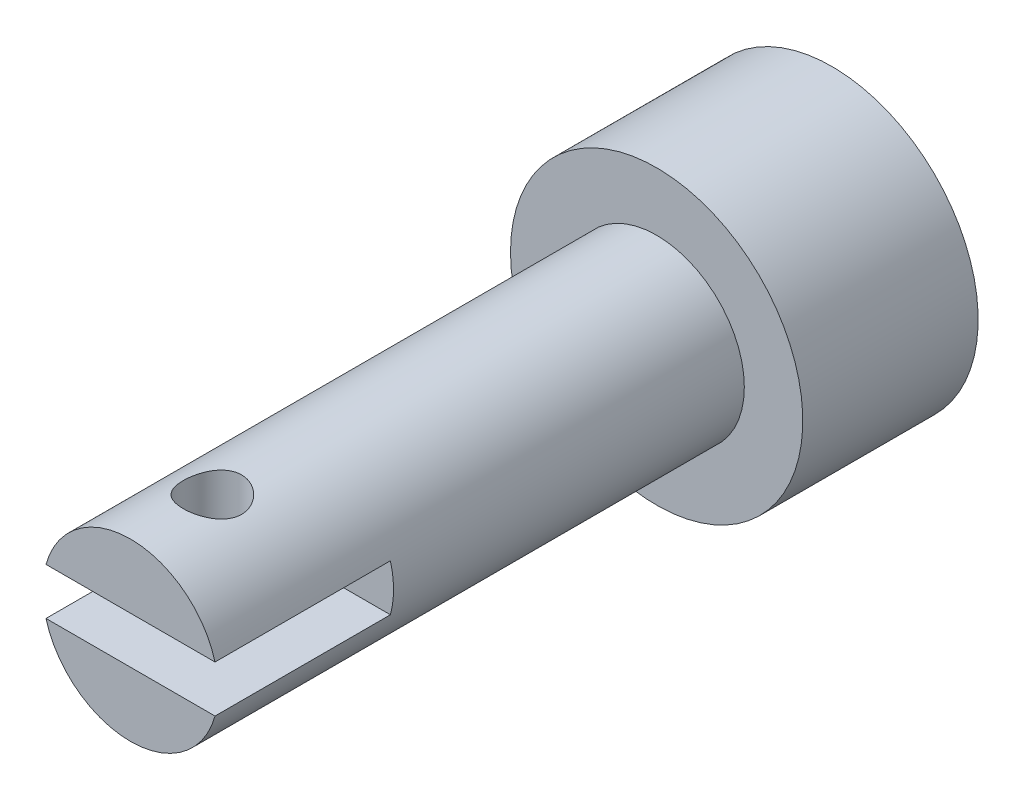
ISO-10303-21;
HEADER;
FILE_DESCRIPTION(('STEP AP214'),'2;1');
FILE_NAME('part.step','',(''),(''),'','','');
FILE_SCHEMA(('AUTOMOTIVE_DESIGN { 1 0 10303 214 1 1 1 1 }'));
ENDSEC;
DATA;
#1=APPLICATION_CONTEXT('core data for automotive mechanical design processes');
#2=APPLICATION_PROTOCOL_DEFINITION('international standard','automotive_design',2000,#1);
#3=PRODUCT_CONTEXT('',#1,'mechanical');
#4=PRODUCT('Part','Part','',(#3));
#5=PRODUCT_RELATED_PRODUCT_CATEGORY('part','',(#4));
#6=PRODUCT_DEFINITION_FORMATION('','',#4);
#7=PRODUCT_DEFINITION_CONTEXT('part definition',#1,'design');
#8=PRODUCT_DEFINITION('design','',#6,#7);
#9=PRODUCT_DEFINITION_SHAPE('','',#8);
#10=(LENGTH_UNIT() NAMED_UNIT(*) SI_UNIT(.MILLI.,.METRE.));
#11=(NAMED_UNIT(*) PLANE_ANGLE_UNIT() SI_UNIT($,.RADIAN.));
#12=(NAMED_UNIT(*) SI_UNIT($,.STERADIAN.) SOLID_ANGLE_UNIT());
#13=UNCERTAINTY_MEASURE_WITH_UNIT(LENGTH_MEASURE(1.E-05),#10,'distance_accuracy_value','');
#14=(GEOMETRIC_REPRESENTATION_CONTEXT(3) GLOBAL_UNCERTAINTY_ASSIGNED_CONTEXT((#13)) GLOBAL_UNIT_ASSIGNED_CONTEXT((#10,
#11,#12)) REPRESENTATION_CONTEXT('',''));
#15=CARTESIAN_POINT('',(0.,0.,0.));
#16=DIRECTION('',(0.,0.,1.));
#17=DIRECTION('',(1.,0.,0.));
#18=AXIS2_PLACEMENT_3D('',#15,#16,#17);
#19=CARTESIAN_POINT('',(0.,0.,30.));
#20=DIRECTION('',(0.,0.,-1.));
#21=DIRECTION('',(-1.,0.,0.));
#22=AXIS2_PLACEMENT_3D('',#19,#20,#21);
#23=CYLINDRICAL_SURFACE('',#22,7.5);
#24=CARTESIAN_POINT('',(0.,0.,15.));
#25=DIRECTION('',(0.,0.,1.));
#26=DIRECTION('',(1.,0.,0.));
#27=AXIS2_PLACEMENT_3D('',#24,#25,#26);
#28=CIRCLE('',#27,7.5);
#29=CARTESIAN_POINT('',(-7.22841614740048,2.,15.));
#30=VERTEX_POINT('',#29);
#31=CARTESIAN_POINT('',(-7.22841614740048,-2.,15.));
#32=VERTEX_POINT('',#31);
#33=EDGE_CURVE('E45',#30,#32,#28,.T.);
#34=ORIENTED_EDGE('',*,*,#33,.F.);
#35=DIRECTION('',(0.,0.,-1.));
#36=VECTOR('',#35,1.);
#37=CARTESIAN_POINT('',(-7.22841614740048,2.,30.));
#38=LINE('',#37,#36);
#39=CARTESIAN_POINT('',(-7.22841614740048,2.,30.));
#40=VERTEX_POINT('',#39);
#41=EDGE_CURVE('E60',#30,#40,#38,.F.);
#42=ORIENTED_EDGE('',*,*,#41,.T.);
#43=CARTESIAN_POINT('',(0.,0.,30.));
#44=DIRECTION('',(0.,0.,1.));
#45=DIRECTION('',(1.,0.,0.));
#46=AXIS2_PLACEMENT_3D('',#43,#44,#45);
#47=CIRCLE('',#46,7.5);
#48=CARTESIAN_POINT('',(7.22841614740048,2.,30.));
#49=VERTEX_POINT('',#48);
#50=EDGE_CURVE('E86',#49,#40,#47,.T.);
#51=ORIENTED_EDGE('',*,*,#50,.F.);
#52=DIRECTION('',(0.,0.,-1.));
#53=VECTOR('',#52,1.);
#54=CARTESIAN_POINT('',(7.22841614740048,2.,30.));
#55=LINE('',#54,#53);
#56=CARTESIAN_POINT('',(7.22841614740048,2.,15.));
#57=VERTEX_POINT('',#56);
#58=EDGE_CURVE('E98',#49,#57,#55,.T.);
#59=ORIENTED_EDGE('',*,*,#58,.T.);
#60=CARTESIAN_POINT('',(7.22841614740048,-2.,15.));
#61=VERTEX_POINT('',#60);
#62=EDGE_CURVE('E94',#61,#57,#28,.T.);
#63=ORIENTED_EDGE('',*,*,#62,.F.);
#64=DIRECTION('',(0.,0.,-1.));
#65=VECTOR('',#64,1.);
#66=CARTESIAN_POINT('',(7.22841614740048,-2.,30.));
#67=LINE('',#66,#65);
#68=CARTESIAN_POINT('',(7.22841614740048,-2.,30.));
#69=VERTEX_POINT('',#68);
#70=EDGE_CURVE('E80',#61,#69,#67,.F.);
#71=ORIENTED_EDGE('',*,*,#70,.T.);
#72=CARTESIAN_POINT('',(-7.22841614740048,-2.,30.));
#73=VERTEX_POINT('',#72);
#74=EDGE_CURVE('E92',#73,#69,#47,.T.);
#75=ORIENTED_EDGE('',*,*,#74,.F.);
#76=DIRECTION('',(0.,0.,-1.));
#77=VECTOR('',#76,1.);
#78=CARTESIAN_POINT('',(-7.22841614740048,-2.,30.));
#79=LINE('',#78,#77);
#80=EDGE_CURVE('E52',#73,#32,#79,.T.);
#81=ORIENTED_EDGE('',*,*,#80,.T.);
#82=EDGE_LOOP('',(#34,#42,#51,#59,#63,#71,#75,#81));
#83=FACE_BOUND('',#82,.T.);
#84=CARTESIAN_POINT('',(0.,7.5,25.5));
#85=CARTESIAN_POINT('',(-0.136408407216808,7.5000003825236,25.5000006343291));
#86=CARTESIAN_POINT('',(-0.272812986346374,7.49624423768862,25.488799334682));
#87=CARTESIAN_POINT('',(-0.54160440218243,7.48163025508202,25.444427227957));
#88=CARTESIAN_POINT('',(-0.673990820297044,7.47077168005381,25.4112541401277));
#89=CARTESIAN_POINT('',(-0.930831973754441,7.44313269766107,25.3242018915399));
#90=CARTESIAN_POINT('',(-1.05529956471509,7.42636219327133,25.2703573438518));
#91=CARTESIAN_POINT('',(-1.29343734201331,7.38861114293354,25.1436470679041));
#92=CARTESIAN_POINT('',(-1.40710539239676,7.36762976669445,25.0707775874935));
#93=CARTESIAN_POINT('',(-1.62435418755567,7.32285236107512,24.9054354878531));
#94=CARTESIAN_POINT('',(-1.72750925074577,7.29898891159462,24.8124219143488));
#95=CARTESIAN_POINT('',(-1.91708173175521,7.25150786957803,24.6105821132336));
#96=CARTESIAN_POINT('',(-2.00349546372366,7.22789033226373,24.5017524126787));
#97=CARTESIAN_POINT('',(-2.15956235556965,7.18283331193184,24.2675372120089));
#98=CARTESIAN_POINT('',(-2.22866214555258,7.1614759818922,24.1417656506697));
#99=CARTESIAN_POINT('',(-2.3445471846943,7.12438263546503,23.8795597638536));
#100=CARTESIAN_POINT('',(-2.39133924346691,7.10864490401864,23.7431287070931));
#101=CARTESIAN_POINT('',(-2.45968365377291,7.08528258173443,23.4683169462582));
#102=CARTESIAN_POINT('',(-2.48203362067942,7.07740239424028,23.3301569787773));
#103=CARTESIAN_POINT('',(-2.50335280833619,7.06989141573769,23.0518406146103));
#104=CARTESIAN_POINT('',(-2.5023292540118,7.07025807556825,22.911684848227));
#105=CARTESIAN_POINT('',(-2.47754975925855,7.0789753752045,22.6401584238899));
#106=CARTESIAN_POINT('',(-2.45483478291749,7.08696039668832,22.5086789927025));
#107=CARTESIAN_POINT('',(-2.38901540712355,7.10941644311377,22.2515164509829));
#108=CARTESIAN_POINT('',(-2.34590856647968,7.12388824460269,22.1258340364123));
#109=CARTESIAN_POINT('',(-2.23984764515053,7.15794777828122,21.8814681260213));
#110=CARTESIAN_POINT('',(-2.17658512176816,7.17761414482793,21.7629299363262));
#111=CARTESIAN_POINT('',(-2.03222276575785,7.21981396439316,21.5378227293007));
#112=CARTESIAN_POINT('',(-1.95111778091001,7.24234824476159,21.4312571826665));
#113=CARTESIAN_POINT('',(-1.76837333170559,7.28918322919352,21.2272710045981));
#114=CARTESIAN_POINT('',(-1.66588287519078,7.31351473387107,21.1306182637273));
#115=CARTESIAN_POINT('',(-1.44584892492516,7.36017345967592,20.9556718333415));
#116=CARTESIAN_POINT('',(-1.32830398915204,7.38250048845168,20.8773799045888));
#117=CARTESIAN_POINT('',(-1.07986903261567,7.42292769844484,20.7407592494123));
#118=CARTESIAN_POINT('',(-0.948858191040844,7.44098375020098,20.6826362716482));
#119=CARTESIAN_POINT('',(-0.678172708411271,7.47051417861087,20.5894920651107));
#120=CARTESIAN_POINT('',(-0.538501095387386,7.48199084137198,20.5544628114414));
#121=CARTESIAN_POINT('',(-0.260959573823261,7.49669067678601,20.5098608349441));
#122=CARTESIAN_POINT('',(-0.123273999662116,7.5002500458432,20.4992504770681));
#123=CARTESIAN_POINT('',(0.151937674900593,7.49972256737068,20.5008316839962));
#124=CARTESIAN_POINT('',(0.289463798299125,7.49563701048406,20.5130193999497));
#125=CARTESIAN_POINT('',(0.556299665760638,7.48050061792761,20.5590297693399));
#126=CARTESIAN_POINT('',(0.685732017087108,7.46965496777981,20.5922155151237));
#127=CARTESIAN_POINT('',(0.937139896448934,7.44229617075175,20.6784836111668));
#128=CARTESIAN_POINT('',(1.05911447127152,7.42578230116688,20.7315684986695));
#129=CARTESIAN_POINT('',(1.29572074098318,7.38822328218224,20.857676079602));
#130=CARTESIAN_POINT('',(1.41007489804287,7.36707036889465,20.9311864832079));
#131=CARTESIAN_POINT('',(1.62516207533897,7.32263134790656,21.0954853750337));
#132=CARTESIAN_POINT('',(1.72589091948894,7.29934458984569,21.1862791400794));
#133=CARTESIAN_POINT('',(1.91563126951575,7.25192119951112,21.3874468775165));
#134=CARTESIAN_POINT('',(2.00390242311443,7.2277940271857,21.4985230673172));
#135=CARTESIAN_POINT('',(2.16064380580894,7.18249933236772,21.7344289195272));
#136=CARTESIAN_POINT('',(2.22911386982753,7.16133183455006,21.8592586965852));
#137=CARTESIAN_POINT('',(2.34399232604091,7.12455979478459,22.1191825382247));
#138=CARTESIAN_POINT('',(2.39044533041255,7.10894401982447,22.2542551979219));
#139=CARTESIAN_POINT('',(2.45973666689839,7.08527080766124,22.5309466251103));
#140=CARTESIAN_POINT('',(2.48258563738485,7.07720996559098,22.6725624135109));
#141=CARTESIAN_POINT('',(2.50319070619336,7.06994647185443,22.9504927401023));
#142=CARTESIAN_POINT('',(2.502175643271,7.07031000643538,23.0867058507171));
#143=CARTESIAN_POINT('',(2.47810573362174,7.07878174559668,23.3569126873052));
#144=CARTESIAN_POINT('',(2.45505219864647,7.08688948923404,23.4909065448877));
#145=CARTESIAN_POINT('',(2.38842953282337,7.10961310762229,23.7503391575062));
#146=CARTESIAN_POINT('',(2.34525836503879,7.12410245056194,23.8758920625112));
#147=CARTESIAN_POINT('',(2.23994841439937,7.15790997046171,24.1180685173457));
#148=CARTESIAN_POINT('',(2.17780542138452,7.17722921908483,24.23469007797));
#149=CARTESIAN_POINT('',(2.03315173145858,7.21957073065116,24.4612091748073));
#150=CARTESIAN_POINT('',(1.94987060691145,7.24271779105343,24.570591254746));
#151=CARTESIAN_POINT('',(1.76660720783912,7.28958390708132,24.7742245334605));
#152=CARTESIAN_POINT('',(1.66662021112871,7.31330312280931,24.8684714392202));
#153=CARTESIAN_POINT('',(1.44810389230172,7.3597507631386,25.0428610307229));
#154=CARTESIAN_POINT('',(1.32900378374933,7.38240454503141,25.1223108693775));
#155=CARTESIAN_POINT('',(1.07839339351657,7.4231497793153,25.2599760721266));
#156=CARTESIAN_POINT('',(0.946886295330875,7.44124239769824,25.3181968648051));
#157=CARTESIAN_POINT('',(0.681234118002442,7.47013787671354,25.4093040812217));
#158=CARTESIAN_POINT('',(0.547469394191023,7.48123031056307,25.4432061656584));
#159=CARTESIAN_POINT('',(0.275801040025618,7.49616017660555,25.4885507016928));
#160=CARTESIAN_POINT('',(0.137898563921866,7.49999961329762,25.4999993587413));
#161=CARTESIAN_POINT('',(0.,7.5,25.5));
#162=B_SPLINE_CURVE_WITH_KNOTS('',3,(#84,#85,#86,#87,#88,#89,#90,#91,#92,#93,#94,#95,#96,#97,
#98,#99,#100,#101,#102,#103,#104,#105,#106,#107,#108,#109,#110,#111,#112,#113,#114,#115,#116,
#117,#118,#119,#120,#121,#122,#123,#124,#125,#126,#127,#128,#129,#130,#131,#132,#133,#134,#135,
#136,#137,#138,#139,#140,#141,#142,#143,#144,#145,#146,#147,#148,#149,#150,#151,#152,#153,#154,
#155,#156,#157,#158,#159,#160,#161),.UNSPECIFIED.,.T.,.F.,(4,2,2,2,2,2,2,2,2,2,2,2,2,2,2,2,2,2,
2,2,2,2,2,2,2,2,2,2,2,2,2,2,2,2,2,2,2,2,4),(0.,0.408717765065027,0.817477963168801,
1.22555668217568,1.63371594449775,2.0546171070689,2.47561083218826,2.90870962058676,
3.34167611732083,3.760048143546,4.17829084968714,4.57742066378201,4.97659827138705,
5.38220427887827,5.78792756395519,6.21483264528418,6.64177864916546,7.07296014125894,
7.50399172193021,7.91633957937925,8.32861782910442,8.72895394945534,9.1293411321026,
9.54025999609341,9.95130452054728,10.3810255720188,10.8107502058749,11.2396003456693,
11.668257117646,12.0748916516065,12.4815019837844,12.8803896770104,13.2793659543994,
13.6957516672951,14.1122552780945,14.5449915208775,14.9776170288114,15.3909139593453,
15.8040966509535),.UNSPECIFIED.);
#163=CARTESIAN_POINT('',(0.,7.5,25.5));
#164=VERTEX_POINT('',#163);
#165=EDGE_CURVE('E112',#164,#164,#162,.T.);
#166=ORIENTED_EDGE('',*,*,#165,.T.);
#167=EDGE_LOOP('',(#166));
#168=FACE_BOUND('',#167,.T.);
#169=CARTESIAN_POINT('',(0.,-7.5,25.5));
#170=CARTESIAN_POINT('',(0.136408407216808,-7.5000003825236,25.5000006343291));
#171=CARTESIAN_POINT('',(0.272812986346374,-7.49624423768862,25.488799334682));
#172=CARTESIAN_POINT('',(0.54160440218243,-7.48163025508202,25.444427227957));
#173=CARTESIAN_POINT('',(0.673990820297044,-7.47077168005381,25.4112541401277));
#174=CARTESIAN_POINT('',(0.930831973754441,-7.44313269766107,25.3242018915399));
#175=CARTESIAN_POINT('',(1.05529956471509,-7.42636219327133,25.2703573438518));
#176=CARTESIAN_POINT('',(1.29343734201331,-7.38861114293354,25.1436470679041));
#177=CARTESIAN_POINT('',(1.40710539239676,-7.36762976669445,25.0707775874935));
#178=CARTESIAN_POINT('',(1.62435418755567,-7.32285236107512,24.9054354878531));
#179=CARTESIAN_POINT('',(1.72750925074577,-7.29898891159462,24.8124219143488));
#180=CARTESIAN_POINT('',(1.91708173175521,-7.25150786957803,24.6105821132336));
#181=CARTESIAN_POINT('',(2.00349546372366,-7.22789033226373,24.5017524126787));
#182=CARTESIAN_POINT('',(2.15956235556965,-7.18283331193184,24.2675372120089));
#183=CARTESIAN_POINT('',(2.22866214555258,-7.1614759818922,24.1417656506697));
#184=CARTESIAN_POINT('',(2.3445471846943,-7.12438263546503,23.8795597638536));
#185=CARTESIAN_POINT('',(2.39133924346691,-7.10864490401864,23.7431287070931));
#186=CARTESIAN_POINT('',(2.45968365377291,-7.08528258173443,23.4683169462582));
#187=CARTESIAN_POINT('',(2.48203362067942,-7.07740239424028,23.3301569787773));
#188=CARTESIAN_POINT('',(2.50335280833619,-7.06989141573769,23.0518406146103));
#189=CARTESIAN_POINT('',(2.5023292540118,-7.07025807556825,22.911684848227));
#190=CARTESIAN_POINT('',(2.47754975925855,-7.0789753752045,22.6401584238899));
#191=CARTESIAN_POINT('',(2.45483478291749,-7.08696039668832,22.5086789927025));
#192=CARTESIAN_POINT('',(2.38901540712355,-7.10941644311377,22.2515164509829));
#193=CARTESIAN_POINT('',(2.34590856647968,-7.12388824460269,22.1258340364123));
#194=CARTESIAN_POINT('',(2.23984764515053,-7.15794777828122,21.8814681260213));
#195=CARTESIAN_POINT('',(2.17658512176816,-7.17761414482793,21.7629299363262));
#196=CARTESIAN_POINT('',(2.03222276575785,-7.21981396439316,21.5378227293007));
#197=CARTESIAN_POINT('',(1.95111778091001,-7.24234824476159,21.4312571826665));
#198=CARTESIAN_POINT('',(1.76837333170559,-7.28918322919352,21.2272710045981));
#199=CARTESIAN_POINT('',(1.66588287519078,-7.31351473387107,21.1306182637273));
#200=CARTESIAN_POINT('',(1.44584892492516,-7.36017345967592,20.9556718333415));
#201=CARTESIAN_POINT('',(1.32830398915204,-7.38250048845168,20.8773799045888));
#202=CARTESIAN_POINT('',(1.07986903261567,-7.42292769844484,20.7407592494123));
#203=CARTESIAN_POINT('',(0.948858191040844,-7.44098375020098,20.6826362716482));
#204=CARTESIAN_POINT('',(0.678172708411271,-7.47051417861087,20.5894920651107));
#205=CARTESIAN_POINT('',(0.538501095387386,-7.48199084137198,20.5544628114414));
#206=CARTESIAN_POINT('',(0.260959573823261,-7.49669067678601,20.5098608349441));
#207=CARTESIAN_POINT('',(0.123273999662116,-7.5002500458432,20.4992504770681));
#208=CARTESIAN_POINT('',(-0.151937674900593,-7.49972256737068,20.5008316839962));
#209=CARTESIAN_POINT('',(-0.289463798299125,-7.49563701048406,20.5130193999497));
#210=CARTESIAN_POINT('',(-0.556299665760638,-7.48050061792761,20.5590297693399));
#211=CARTESIAN_POINT('',(-0.685732017087108,-7.46965496777981,20.5922155151237));
#212=CARTESIAN_POINT('',(-0.937139896448934,-7.44229617075175,20.6784836111668));
#213=CARTESIAN_POINT('',(-1.05911447127152,-7.42578230116688,20.7315684986695));
#214=CARTESIAN_POINT('',(-1.29572074098318,-7.38822328218224,20.857676079602));
#215=CARTESIAN_POINT('',(-1.41007489804287,-7.36707036889465,20.9311864832079));
#216=CARTESIAN_POINT('',(-1.62516207533897,-7.32263134790656,21.0954853750337));
#217=CARTESIAN_POINT('',(-1.72589091948894,-7.29934458984569,21.1862791400794));
#218=CARTESIAN_POINT('',(-1.91563126951575,-7.25192119951112,21.3874468775165));
#219=CARTESIAN_POINT('',(-2.00390242311443,-7.2277940271857,21.4985230673172));
#220=CARTESIAN_POINT('',(-2.16064380580894,-7.18249933236772,21.7344289195272));
#221=CARTESIAN_POINT('',(-2.22911386982753,-7.16133183455006,21.8592586965852));
#222=CARTESIAN_POINT('',(-2.34399232604091,-7.12455979478459,22.1191825382247));
#223=CARTESIAN_POINT('',(-2.39044533041255,-7.10894401982447,22.2542551979219));
#224=CARTESIAN_POINT('',(-2.45973666689839,-7.08527080766124,22.5309466251103));
#225=CARTESIAN_POINT('',(-2.48258563738485,-7.07720996559098,22.6725624135109));
#226=CARTESIAN_POINT('',(-2.50319070619336,-7.06994647185443,22.9504927401023));
#227=CARTESIAN_POINT('',(-2.502175643271,-7.07031000643538,23.0867058507171));
#228=CARTESIAN_POINT('',(-2.47810573362174,-7.07878174559668,23.3569126873052));
#229=CARTESIAN_POINT('',(-2.45505219864647,-7.08688948923404,23.4909065448877));
#230=CARTESIAN_POINT('',(-2.38842953282337,-7.10961310762229,23.7503391575062));
#231=CARTESIAN_POINT('',(-2.34525836503879,-7.12410245056194,23.8758920625112));
#232=CARTESIAN_POINT('',(-2.23994841439937,-7.15790997046171,24.1180685173457));
#233=CARTESIAN_POINT('',(-2.17780542138452,-7.17722921908483,24.23469007797));
#234=CARTESIAN_POINT('',(-2.03315173145858,-7.21957073065116,24.4612091748073));
#235=CARTESIAN_POINT('',(-1.94987060691145,-7.24271779105343,24.570591254746));
#236=CARTESIAN_POINT('',(-1.76660720783912,-7.28958390708132,24.7742245334605));
#237=CARTESIAN_POINT('',(-1.66662021112871,-7.31330312280931,24.8684714392202));
#238=CARTESIAN_POINT('',(-1.44810389230172,-7.3597507631386,25.0428610307229));
#239=CARTESIAN_POINT('',(-1.32900378374933,-7.38240454503141,25.1223108693775));
#240=CARTESIAN_POINT('',(-1.07839339351657,-7.4231497793153,25.2599760721266));
#241=CARTESIAN_POINT('',(-0.946886295330875,-7.44124239769824,25.3181968648051));
#242=CARTESIAN_POINT('',(-0.681234118002442,-7.47013787671354,25.4093040812217));
#243=CARTESIAN_POINT('',(-0.547469394191023,-7.48123031056307,25.4432061656584));
#244=CARTESIAN_POINT('',(-0.275801040025618,-7.49616017660555,25.4885507016928));
#245=CARTESIAN_POINT('',(-0.137898563921866,-7.49999961329762,25.4999993587413));
#246=CARTESIAN_POINT('',(0.,-7.5,25.5));
#247=B_SPLINE_CURVE_WITH_KNOTS('',3,(#169,#170,#171,#172,#173,#174,#175,#176,#177,#178,#179,
#180,#181,#182,#183,#184,#185,#186,#187,#188,#189,#190,#191,#192,#193,#194,#195,#196,#197,#198,
#199,#200,#201,#202,#203,#204,#205,#206,#207,#208,#209,#210,#211,#212,#213,#214,#215,#216,#217,
#218,#219,#220,#221,#222,#223,#224,#225,#226,#227,#228,#229,#230,#231,#232,#233,#234,#235,#236,
#237,#238,#239,#240,#241,#242,#243,#244,#245,#246),.UNSPECIFIED.,.T.,.F.,(4,2,2,2,2,2,2,2,2,2,2,
2,2,2,2,2,2,2,2,2,2,2,2,2,2,2,2,2,2,2,2,2,2,2,2,2,2,2,4),(0.,0.408717765065027,
0.817477963168801,1.22555668217568,1.63371594449775,2.0546171070689,2.47561083218826,
2.90870962058676,3.34167611732083,3.760048143546,4.17829084968714,4.57742066378201,
4.97659827138705,5.38220427887827,5.78792756395519,6.21483264528418,6.64177864916546,
7.07296014125894,7.50399172193021,7.91633957937925,8.32861782910442,8.72895394945534,
9.1293411321026,9.54025999609341,9.95130452054728,10.3810255720188,10.8107502058749,
11.2396003456693,11.668257117646,12.0748916516065,12.4815019837844,12.8803896770104,
13.2793659543994,13.6957516672951,14.1122552780945,14.5449915208775,14.9776170288114,
15.3909139593453,15.8040966509535),.UNSPECIFIED.);
#248=CARTESIAN_POINT('',(0.,-7.5,25.5));
#249=VERTEX_POINT('',#248);
#250=EDGE_CURVE('E127',#249,#249,#247,.T.);
#251=ORIENTED_EDGE('',*,*,#250,.T.);
#252=EDGE_LOOP('',(#251));
#253=FACE_BOUND('',#252,.T.);
#254=CARTESIAN_POINT('',(0.,0.,-15.));
#255=DIRECTION('',(0.,0.,-1.));
#256=DIRECTION('',(-1.,0.,0.));
#257=AXIS2_PLACEMENT_3D('',#254,#255,#256);
#258=CIRCLE('',#257,7.5);
#259=CARTESIAN_POINT('',(-7.5,0.,-15.));
#260=VERTEX_POINT('',#259);
#261=EDGE_CURVE('E11',#260,#260,#258,.T.);
#262=ORIENTED_EDGE('',*,*,#261,.F.);
#263=EDGE_LOOP('',(#262));
#264=FACE_BOUND('',#263,.T.);
#265=ADVANCED_FACE('F37',(#83,#168,#253,#264),#23,.T.);
#266=CARTESIAN_POINT('',(0.,0.,30.));
#267=DIRECTION('',(0.,0.,1.));
#268=DIRECTION('',(1.,0.,0.));
#269=AXIS2_PLACEMENT_3D('',#266,#267,#268);
#270=PLANE('',#269);
#271=DIRECTION('',(-1.,0.,0.));
#272=VECTOR('',#271,1.);
#273=CARTESIAN_POINT('',(0.,2.,30.));
#274=LINE('',#273,#272);
#275=EDGE_CURVE('E85',#49,#40,#274,.T.);
#276=ORIENTED_EDGE('',*,*,#275,.F.);
#277=ORIENTED_EDGE('',*,*,#50,.T.);
#278=EDGE_LOOP('',(#276,#277));
#279=FACE_BOUND('',#278,.T.);
#280=ADVANCED_FACE('F152',(#279),#270,.T.);
#281=DIRECTION('',(1.,0.,0.));
#282=VECTOR('',#281,1.);
#283=CARTESIAN_POINT('',(0.,-2.,30.));
#284=LINE('',#283,#282);
#285=EDGE_CURVE('E77',#73,#69,#284,.T.);
#286=ORIENTED_EDGE('',*,*,#285,.F.);
#287=ORIENTED_EDGE('',*,*,#74,.T.);
#288=EDGE_LOOP('',(#286,#287));
#289=FACE_BOUND('',#288,.T.);
#290=ADVANCED_FACE('F97',(#289),#270,.T.);
#291=CARTESIAN_POINT('',(0.,0.,15.));
#292=DIRECTION('',(0.,0.,1.));
#293=DIRECTION('',(1.,0.,0.));
#294=AXIS2_PLACEMENT_3D('',#291,#292,#293);
#295=PLANE('',#294);
#296=ORIENTED_EDGE('',*,*,#33,.T.);
#297=DIRECTION('',(1.,0.,0.));
#298=VECTOR('',#297,1.);
#299=CARTESIAN_POINT('',(10.,-2.,15.));
#300=LINE('',#299,#298);
#301=EDGE_CURVE('E171',#32,#61,#300,.T.);
#302=ORIENTED_EDGE('',*,*,#301,.T.);
#303=ORIENTED_EDGE('',*,*,#62,.T.);
#304=DIRECTION('',(-1.,0.,0.));
#305=VECTOR('',#304,1.);
#306=CARTESIAN_POINT('',(10.,2.,15.));
#307=LINE('',#306,#305);
#308=EDGE_CURVE('E95',#57,#30,#307,.T.);
#309=ORIENTED_EDGE('',*,*,#308,.T.);
#310=EDGE_LOOP('',(#296,#302,#303,#309));
#311=FACE_BOUND('',#310,.T.);
#312=ADVANCED_FACE('F140',(#311),#295,.T.);
#313=CARTESIAN_POINT('',(10.,2.,15.));
#314=DIRECTION('',(0.,1.,0.));
#315=DIRECTION('',(-1.,0.,0.));
#316=AXIS2_PLACEMENT_3D('',#313,#314,#315);
#317=PLANE('',#316);
#318=CARTESIAN_POINT('',(0.,2.,23.));
#319=DIRECTION('',(0.,1.,0.));
#320=DIRECTION('',(-1.,0.,0.));
#321=AXIS2_PLACEMENT_3D('',#318,#319,#320);
#322=CIRCLE('',#321,2.5);
#323=CARTESIAN_POINT('',(-2.5,2.,23.));
#324=VERTEX_POINT('',#323);
#325=EDGE_CURVE('E107',#324,#324,#322,.T.);
#326=ORIENTED_EDGE('',*,*,#325,.T.);
#327=EDGE_LOOP('',(#326));
#328=FACE_BOUND('',#327,.T.);
#329=ORIENTED_EDGE('',*,*,#275,.T.);
#330=ORIENTED_EDGE('',*,*,#41,.F.);
#331=ORIENTED_EDGE('',*,*,#308,.F.);
#332=ORIENTED_EDGE('',*,*,#58,.F.);
#333=EDGE_LOOP('',(#329,#330,#331,#332));
#334=FACE_BOUND('',#333,.T.);
#335=ADVANCED_FACE('F144',(#328,#334),#317,.F.);
#336=CARTESIAN_POINT('',(10.,-2.,15.));
#337=DIRECTION('',(0.,-1.,0.));
#338=DIRECTION('',(1.,0.,0.));
#339=AXIS2_PLACEMENT_3D('',#336,#337,#338);
#340=PLANE('',#339);
#341=CARTESIAN_POINT('',(0.,-2.,23.));
#342=DIRECTION('',(0.,-1.,0.));
#343=DIRECTION('',(1.,0.,0.));
#344=AXIS2_PLACEMENT_3D('',#341,#342,#343);
#345=CIRCLE('',#344,2.5);
#346=CARTESIAN_POINT('',(2.5,-2.,23.));
#347=VERTEX_POINT('',#346);
#348=EDGE_CURVE('E105',#347,#347,#345,.T.);
#349=ORIENTED_EDGE('',*,*,#348,.T.);
#350=EDGE_LOOP('',(#349));
#351=FACE_BOUND('',#350,.T.);
#352=ORIENTED_EDGE('',*,*,#285,.T.);
#353=ORIENTED_EDGE('',*,*,#70,.F.);
#354=ORIENTED_EDGE('',*,*,#301,.F.);
#355=ORIENTED_EDGE('',*,*,#80,.F.);
#356=EDGE_LOOP('',(#352,#353,#354,#355));
#357=FACE_BOUND('',#356,.T.);
#358=ADVANCED_FACE('F79',(#351,#357),#340,.F.);
#359=CARTESIAN_POINT('',(0.,-7.5,23.));
#360=DIRECTION('',(0.,1.,0.));
#361=DIRECTION('',(0.,0.,1.));
#362=AXIS2_PLACEMENT_3D('',#359,#360,#361);
#363=CYLINDRICAL_SURFACE('',#362,2.5);
#364=ORIENTED_EDGE('',*,*,#348,.F.);
#365=EDGE_LOOP('',(#364));
#366=FACE_BOUND('',#365,.T.);
#367=ORIENTED_EDGE('',*,*,#250,.F.);
#368=EDGE_LOOP('',(#367));
#369=FACE_BOUND('',#368,.T.);
#370=ADVANCED_FACE('F131',(#366,#369),#363,.F.);
#371=ORIENTED_EDGE('',*,*,#325,.F.);
#372=EDGE_LOOP('',(#371));
#373=FACE_BOUND('',#372,.T.);
#374=ORIENTED_EDGE('',*,*,#165,.F.);
#375=EDGE_LOOP('',(#374));
#376=FACE_BOUND('',#375,.T.);
#377=ADVANCED_FACE('F136',(#373,#376),#363,.F.);
#378=CARTESIAN_POINT('',(0.,0.,-15.));
#379=DIRECTION('',(0.,0.,-1.));
#380=DIRECTION('',(-1.,0.,0.));
#381=AXIS2_PLACEMENT_3D('',#378,#379,#380);
#382=PLANE('',#381);
#383=CARTESIAN_POINT('',(0.,0.,-15.));
#384=DIRECTION('',(0.,0.,-1.));
#385=DIRECTION('',(-1.,0.,0.));
#386=AXIS2_PLACEMENT_3D('',#383,#384,#385);
#387=CIRCLE('',#386,12.5);
#388=CARTESIAN_POINT('',(-12.5,0.,-15.));
#389=VERTEX_POINT('',#388);
#390=EDGE_CURVE('E108',#389,#389,#387,.T.);
#391=ORIENTED_EDGE('',*,*,#390,.F.);
#392=EDGE_LOOP('',(#391));
#393=FACE_BOUND('',#392,.T.);
#394=ORIENTED_EDGE('',*,*,#261,.T.);
#395=EDGE_LOOP('',(#394));
#396=FACE_BOUND('',#395,.T.);
#397=ADVANCED_FACE('F159',(#393,#396),#382,.F.);
#398=CARTESIAN_POINT('',(0.,0.,-15.));
#399=DIRECTION('',(0.,0.,-1.));
#400=DIRECTION('',(-1.,0.,0.));
#401=AXIS2_PLACEMENT_3D('',#398,#399,#400);
#402=CYLINDRICAL_SURFACE('',#401,12.5);
#403=ORIENTED_EDGE('',*,*,#390,.T.);
#404=EDGE_LOOP('',(#403));
#405=FACE_BOUND('',#404,.T.);
#406=CARTESIAN_POINT('',(0.,0.,-30.));
#407=DIRECTION('',(0.,0.,-1.));
#408=DIRECTION('',(-1.,0.,0.));
#409=AXIS2_PLACEMENT_3D('',#406,#407,#408);
#410=CIRCLE('',#409,12.5);
#411=CARTESIAN_POINT('',(-12.5,0.,-30.));
#412=VERTEX_POINT('',#411);
#413=EDGE_CURVE('E115',#412,#412,#410,.T.);
#414=ORIENTED_EDGE('',*,*,#413,.F.);
#415=EDGE_LOOP('',(#414));
#416=FACE_BOUND('',#415,.T.);
#417=ADVANCED_FACE('F138',(#405,#416),#402,.T.);
#418=CARTESIAN_POINT('',(0.,0.,-30.));
#419=DIRECTION('',(0.,0.,1.));
#420=DIRECTION('',(1.,0.,0.));
#421=AXIS2_PLACEMENT_3D('',#418,#419,#420);
#422=PLANE('',#421);
#423=ORIENTED_EDGE('',*,*,#413,.T.);
#424=EDGE_LOOP('',(#423));
#425=FACE_BOUND('',#424,.T.);
#426=ADVANCED_FACE('F153',(#425),#422,.F.);
#427=CLOSED_SHELL('',(#265,#280,#290,#312,#335,#358,#370,#377,#397,#417,#426));
#428=MANIFOLD_SOLID_BREP('B2',#427);
#429=ADVANCED_BREP_SHAPE_REPRESENTATION('',(#18,#428),#14);
#430=SHAPE_DEFINITION_REPRESENTATION(#9,#429);
ENDSEC;
END-ISO-10303-21;
